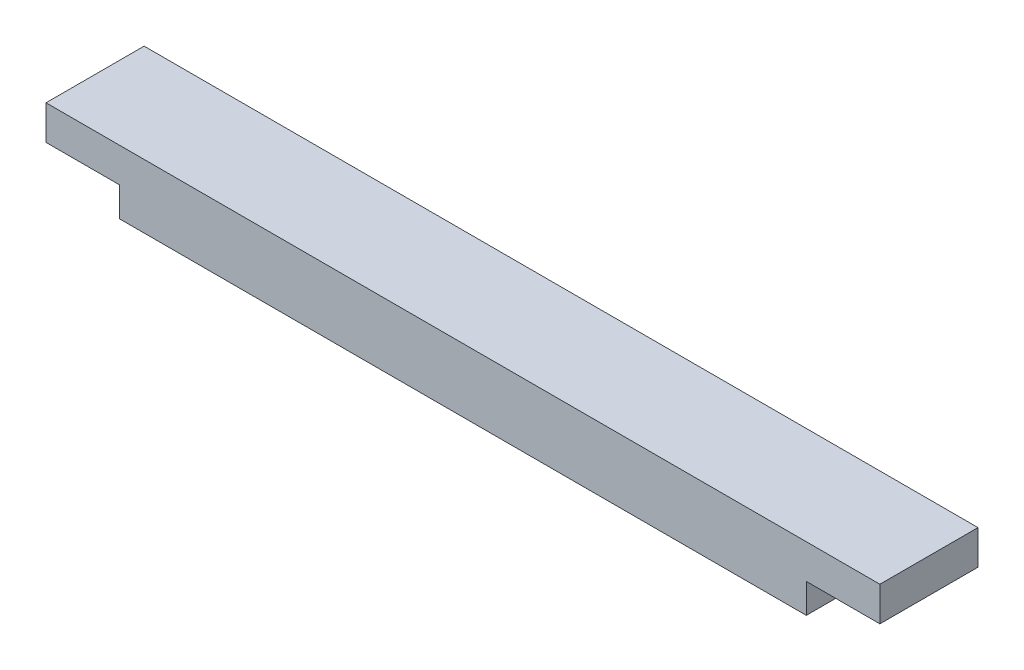
ISO-10303-21;
HEADER;
FILE_DESCRIPTION(('STEP AP214'),'2;1');
FILE_NAME('part.step','',(''),(''),'','','');
FILE_SCHEMA(('AUTOMOTIVE_DESIGN { 1 0 10303 214 1 1 1 1 }'));
ENDSEC;
DATA;
#1=APPLICATION_CONTEXT('core data for automotive mechanical design processes');
#2=APPLICATION_PROTOCOL_DEFINITION('international standard','automotive_design',2000,#1);
#3=PRODUCT_CONTEXT('',#1,'mechanical');
#4=PRODUCT('Part','Part','',(#3));
#5=PRODUCT_RELATED_PRODUCT_CATEGORY('part','',(#4));
#6=PRODUCT_DEFINITION_FORMATION('','',#4);
#7=PRODUCT_DEFINITION_CONTEXT('part definition',#1,'design');
#8=PRODUCT_DEFINITION('design','',#6,#7);
#9=PRODUCT_DEFINITION_SHAPE('','',#8);
#10=(LENGTH_UNIT() NAMED_UNIT(*) SI_UNIT(.MILLI.,.METRE.));
#11=(NAMED_UNIT(*) PLANE_ANGLE_UNIT() SI_UNIT($,.RADIAN.));
#12=(NAMED_UNIT(*) SI_UNIT($,.STERADIAN.) SOLID_ANGLE_UNIT());
#13=UNCERTAINTY_MEASURE_WITH_UNIT(LENGTH_MEASURE(1.E-05),#10,'distance_accuracy_value','');
#14=(GEOMETRIC_REPRESENTATION_CONTEXT(3) GLOBAL_UNCERTAINTY_ASSIGNED_CONTEXT((#13)) GLOBAL_UNIT_ASSIGNED_CONTEXT((#10,
#11,#12)) REPRESENTATION_CONTEXT('',''));
#15=CARTESIAN_POINT('',(0.,0.,0.));
#16=DIRECTION('',(0.,0.,1.));
#17=DIRECTION('',(1.,0.,0.));
#18=AXIS2_PLACEMENT_3D('',#15,#16,#17);
#19=CARTESIAN_POINT('',(70.,6.,10.));
#20=DIRECTION('',(-1.,0.,0.));
#21=DIRECTION('',(0.,0.,1.));
#22=AXIS2_PLACEMENT_3D('',#19,#20,#21);
#23=PLANE('',#22);
#24=DIRECTION('',(0.,0.,-1.));
#25=VECTOR('',#24,1.);
#26=CARTESIAN_POINT('',(70.,0.,10.));
#27=LINE('',#26,#25);
#28=CARTESIAN_POINT('',(70.,0.,10.));
#29=VERTEX_POINT('',#28);
#30=CARTESIAN_POINT('',(70.,0.,-10.));
#31=VERTEX_POINT('',#30);
#32=EDGE_CURVE('E129',#29,#31,#27,.T.);
#33=ORIENTED_EDGE('',*,*,#32,.T.);
#34=DIRECTION('',(0.,-1.,0.));
#35=VECTOR('',#34,1.);
#36=CARTESIAN_POINT('',(70.,6.,-10.));
#37=LINE('',#36,#35);
#38=CARTESIAN_POINT('',(70.,6.,-10.));
#39=VERTEX_POINT('',#38);
#40=EDGE_CURVE('E11',#39,#31,#37,.T.);
#41=ORIENTED_EDGE('',*,*,#40,.F.);
#42=DIRECTION('',(0.,0.,-1.));
#43=VECTOR('',#42,1.);
#44=CARTESIAN_POINT('',(70.,6.,10.));
#45=LINE('',#44,#43);
#46=CARTESIAN_POINT('',(70.,6.,10.));
#47=VERTEX_POINT('',#46);
#48=EDGE_CURVE('E137',#47,#39,#45,.T.);
#49=ORIENTED_EDGE('',*,*,#48,.F.);
#50=DIRECTION('',(0.,-1.,0.));
#51=VECTOR('',#50,1.);
#52=CARTESIAN_POINT('',(70.,6.,10.));
#53=LINE('',#52,#51);
#54=EDGE_CURVE('E49',#47,#29,#53,.T.);
#55=ORIENTED_EDGE('',*,*,#54,.T.);
#56=EDGE_LOOP('',(#33,#41,#49,#55));
#57=FACE_BOUND('',#56,.T.);
#58=ADVANCED_FACE('F33',(#57),#23,.F.);
#59=CARTESIAN_POINT('',(-70.,6.,-10.));
#60=DIRECTION('',(0.,0.,1.));
#61=DIRECTION('',(1.,0.,0.));
#62=AXIS2_PLACEMENT_3D('',#59,#60,#61);
#63=PLANE('',#62);
#64=DIRECTION('',(-1.,0.,0.));
#65=VECTOR('',#64,1.);
#66=CARTESIAN_POINT('',(-70.,0.,-10.));
#67=LINE('',#66,#65);
#68=CARTESIAN_POINT('',(-70.,0.,-10.));
#69=VERTEX_POINT('',#68);
#70=EDGE_CURVE('E131',#31,#69,#67,.T.);
#71=ORIENTED_EDGE('',*,*,#70,.T.);
#72=DIRECTION('',(0.,-1.,0.));
#73=VECTOR('',#72,1.);
#74=CARTESIAN_POINT('',(-70.,6.,-10.));
#75=LINE('',#74,#73);
#76=CARTESIAN_POINT('',(-70.,6.,-10.));
#77=VERTEX_POINT('',#76);
#78=EDGE_CURVE('E41',#77,#69,#75,.T.);
#79=ORIENTED_EDGE('',*,*,#78,.F.);
#80=DIRECTION('',(-1.,0.,0.));
#81=VECTOR('',#80,1.);
#82=CARTESIAN_POINT('',(-85.,6.,-10.));
#83=LINE('',#82,#81);
#84=CARTESIAN_POINT('',(-85.,6.,-10.));
#85=VERTEX_POINT('',#84);
#86=EDGE_CURVE('E173',#77,#85,#83,.T.);
#87=ORIENTED_EDGE('',*,*,#86,.T.);
#88=DIRECTION('',(0.,-1.,0.));
#89=VECTOR('',#88,1.);
#90=CARTESIAN_POINT('',(-85.,13.,-10.));
#91=LINE('',#90,#89);
#92=CARTESIAN_POINT('',(-85.,13.,-10.));
#93=VERTEX_POINT('',#92);
#94=EDGE_CURVE('E111',#93,#85,#91,.T.);
#95=ORIENTED_EDGE('',*,*,#94,.F.);
#96=DIRECTION('',(-1.,0.,0.));
#97=VECTOR('',#96,1.);
#98=CARTESIAN_POINT('',(-85.,13.,-10.));
#99=LINE('',#98,#97);
#100=CARTESIAN_POINT('',(85.,13.,-10.));
#101=VERTEX_POINT('',#100);
#102=EDGE_CURVE('E103',#101,#93,#99,.T.);
#103=ORIENTED_EDGE('',*,*,#102,.F.);
#104=DIRECTION('',(0.,-1.,0.));
#105=VECTOR('',#104,1.);
#106=CARTESIAN_POINT('',(85.,13.,-10.));
#107=LINE('',#106,#105);
#108=CARTESIAN_POINT('',(85.,6.,-10.));
#109=VERTEX_POINT('',#108);
#110=EDGE_CURVE('E108',#101,#109,#107,.T.);
#111=ORIENTED_EDGE('',*,*,#110,.T.);
#112=EDGE_CURVE('E160',#109,#39,#83,.T.);
#113=ORIENTED_EDGE('',*,*,#112,.T.);
#114=ORIENTED_EDGE('',*,*,#40,.T.);
#115=EDGE_LOOP('',(#71,#79,#87,#95,#103,#111,#113,#114));
#116=FACE_BOUND('',#115,.T.);
#117=ADVANCED_FACE('F105',(#116),#63,.F.);
#118=CARTESIAN_POINT('',(-70.,6.,10.));
#119=DIRECTION('',(1.,0.,0.));
#120=DIRECTION('',(0.,0.,-1.));
#121=AXIS2_PLACEMENT_3D('',#118,#119,#120);
#122=PLANE('',#121);
#123=DIRECTION('',(0.,0.,1.));
#124=VECTOR('',#123,1.);
#125=CARTESIAN_POINT('',(-70.,0.,10.));
#126=LINE('',#125,#124);
#127=CARTESIAN_POINT('',(-70.,0.,10.));
#128=VERTEX_POINT('',#127);
#129=EDGE_CURVE('E68',#69,#128,#126,.T.);
#130=ORIENTED_EDGE('',*,*,#129,.T.);
#131=DIRECTION('',(0.,-1.,0.));
#132=VECTOR('',#131,1.);
#133=CARTESIAN_POINT('',(-70.,6.,10.));
#134=LINE('',#133,#132);
#135=CARTESIAN_POINT('',(-70.,6.,10.));
#136=VERTEX_POINT('',#135);
#137=EDGE_CURVE('E146',#136,#128,#134,.T.);
#138=ORIENTED_EDGE('',*,*,#137,.F.);
#139=DIRECTION('',(0.,0.,1.));
#140=VECTOR('',#139,1.);
#141=CARTESIAN_POINT('',(-70.,6.,10.));
#142=LINE('',#141,#140);
#143=EDGE_CURVE('E139',#77,#136,#142,.T.);
#144=ORIENTED_EDGE('',*,*,#143,.F.);
#145=ORIENTED_EDGE('',*,*,#78,.T.);
#146=EDGE_LOOP('',(#130,#138,#144,#145));
#147=FACE_BOUND('',#146,.T.);
#148=ADVANCED_FACE('F148',(#147),#122,.F.);
#149=CARTESIAN_POINT('',(-70.,6.,10.));
#150=DIRECTION('',(0.,0.,-1.));
#151=DIRECTION('',(-1.,0.,0.));
#152=AXIS2_PLACEMENT_3D('',#149,#150,#151);
#153=PLANE('',#152);
#154=DIRECTION('',(1.,0.,0.));
#155=VECTOR('',#154,1.);
#156=CARTESIAN_POINT('',(-70.,0.,10.));
#157=LINE('',#156,#155);
#158=EDGE_CURVE('E71',#128,#29,#157,.T.);
#159=ORIENTED_EDGE('',*,*,#158,.T.);
#160=ORIENTED_EDGE('',*,*,#54,.F.);
#161=DIRECTION('',(1.,0.,0.));
#162=VECTOR('',#161,1.);
#163=CARTESIAN_POINT('',(-85.,6.,10.));
#164=LINE('',#163,#162);
#165=CARTESIAN_POINT('',(85.,6.,10.));
#166=VERTEX_POINT('',#165);
#167=EDGE_CURVE('E155',#47,#166,#164,.T.);
#168=ORIENTED_EDGE('',*,*,#167,.T.);
#169=DIRECTION('',(0.,-1.,0.));
#170=VECTOR('',#169,1.);
#171=CARTESIAN_POINT('',(85.,13.,10.));
#172=LINE('',#171,#170);
#173=CARTESIAN_POINT('',(85.,13.,10.));
#174=VERTEX_POINT('',#173);
#175=EDGE_CURVE('E164',#174,#166,#172,.T.);
#176=ORIENTED_EDGE('',*,*,#175,.F.);
#177=DIRECTION('',(1.,0.,0.));
#178=VECTOR('',#177,1.);
#179=CARTESIAN_POINT('',(-85.,13.,10.));
#180=LINE('',#179,#178);
#181=CARTESIAN_POINT('',(-85.,13.,10.));
#182=VERTEX_POINT('',#181);
#183=EDGE_CURVE('E120',#182,#174,#180,.T.);
#184=ORIENTED_EDGE('',*,*,#183,.F.);
#185=DIRECTION('',(0.,-1.,0.));
#186=VECTOR('',#185,1.);
#187=CARTESIAN_POINT('',(-85.,13.,10.));
#188=LINE('',#187,#186);
#189=CARTESIAN_POINT('',(-85.,6.,10.));
#190=VERTEX_POINT('',#189);
#191=EDGE_CURVE('E133',#182,#190,#188,.T.);
#192=ORIENTED_EDGE('',*,*,#191,.T.);
#193=EDGE_CURVE('E124',#190,#136,#164,.T.);
#194=ORIENTED_EDGE('',*,*,#193,.T.);
#195=ORIENTED_EDGE('',*,*,#137,.T.);
#196=EDGE_LOOP('',(#159,#160,#168,#176,#184,#192,#194,#195));
#197=FACE_BOUND('',#196,.T.);
#198=ADVANCED_FACE('F168',(#197),#153,.F.);
#199=CARTESIAN_POINT('',(0.,0.,0.));
#200=DIRECTION('',(0.,-1.,0.));
#201=DIRECTION('',(0.,0.,-1.));
#202=AXIS2_PLACEMENT_3D('',#199,#200,#201);
#203=PLANE('',#202);
#204=ORIENTED_EDGE('',*,*,#32,.F.);
#205=ORIENTED_EDGE('',*,*,#158,.F.);
#206=ORIENTED_EDGE('',*,*,#129,.F.);
#207=ORIENTED_EDGE('',*,*,#70,.F.);
#208=EDGE_LOOP('',(#204,#205,#206,#207));
#209=FACE_BOUND('',#208,.T.);
#210=ADVANCED_FACE('F152',(#209),#203,.T.);
#211=CARTESIAN_POINT('',(0.,6.,0.));
#212=DIRECTION('',(0.,-1.,0.));
#213=DIRECTION('',(0.,0.,-1.));
#214=AXIS2_PLACEMENT_3D('',#211,#212,#213);
#215=PLANE('',#214);
#216=ORIENTED_EDGE('',*,*,#167,.F.);
#217=ORIENTED_EDGE('',*,*,#48,.T.);
#218=ORIENTED_EDGE('',*,*,#112,.F.);
#219=DIRECTION('',(0.,0.,-1.));
#220=VECTOR('',#219,1.);
#221=CARTESIAN_POINT('',(85.,6.,10.));
#222=LINE('',#221,#220);
#223=EDGE_CURVE('E128',#166,#109,#222,.T.);
#224=ORIENTED_EDGE('',*,*,#223,.F.);
#225=EDGE_LOOP('',(#216,#217,#218,#224));
#226=FACE_BOUND('',#225,.T.);
#227=ADVANCED_FACE('F156',(#226),#215,.T.);
#228=CARTESIAN_POINT('',(85.,13.,10.));
#229=DIRECTION('',(-1.,0.,0.));
#230=DIRECTION('',(0.,0.,1.));
#231=AXIS2_PLACEMENT_3D('',#228,#229,#230);
#232=PLANE('',#231);
#233=ORIENTED_EDGE('',*,*,#223,.T.);
#234=ORIENTED_EDGE('',*,*,#110,.F.);
#235=DIRECTION('',(0.,0.,-1.));
#236=VECTOR('',#235,1.);
#237=CARTESIAN_POINT('',(85.,13.,10.));
#238=LINE('',#237,#236);
#239=EDGE_CURVE('E115',#174,#101,#238,.T.);
#240=ORIENTED_EDGE('',*,*,#239,.F.);
#241=ORIENTED_EDGE('',*,*,#175,.T.);
#242=EDGE_LOOP('',(#233,#234,#240,#241));
#243=FACE_BOUND('',#242,.T.);
#244=ADVANCED_FACE('F126',(#243),#232,.F.);
#245=CARTESIAN_POINT('',(-85.,13.,10.));
#246=DIRECTION('',(1.,0.,0.));
#247=DIRECTION('',(0.,0.,-1.));
#248=AXIS2_PLACEMENT_3D('',#245,#246,#247);
#249=PLANE('',#248);
#250=DIRECTION('',(0.,0.,1.));
#251=VECTOR('',#250,1.);
#252=CARTESIAN_POINT('',(-85.,6.,10.));
#253=LINE('',#252,#251);
#254=EDGE_CURVE('E157',#85,#190,#253,.T.);
#255=ORIENTED_EDGE('',*,*,#254,.T.);
#256=ORIENTED_EDGE('',*,*,#191,.F.);
#257=DIRECTION('',(0.,0.,1.));
#258=VECTOR('',#257,1.);
#259=CARTESIAN_POINT('',(-85.,13.,10.));
#260=LINE('',#259,#258);
#261=EDGE_CURVE('E114',#93,#182,#260,.T.);
#262=ORIENTED_EDGE('',*,*,#261,.F.);
#263=ORIENTED_EDGE('',*,*,#94,.T.);
#264=EDGE_LOOP('',(#255,#256,#262,#263));
#265=FACE_BOUND('',#264,.T.);
#266=ADVANCED_FACE('F177',(#265),#249,.F.);
#267=CARTESIAN_POINT('',(0.,13.,0.));
#268=DIRECTION('',(0.,-1.,0.));
#269=DIRECTION('',(0.,0.,-1.));
#270=AXIS2_PLACEMENT_3D('',#267,#268,#269);
#271=PLANE('',#270);
#272=ORIENTED_EDGE('',*,*,#239,.T.);
#273=ORIENTED_EDGE('',*,*,#102,.T.);
#274=ORIENTED_EDGE('',*,*,#261,.T.);
#275=ORIENTED_EDGE('',*,*,#183,.T.);
#276=EDGE_LOOP('',(#272,#273,#274,#275));
#277=FACE_BOUND('',#276,.T.);
#278=ADVANCED_FACE('F118',(#277),#271,.F.);
#279=ORIENTED_EDGE('',*,*,#86,.F.);
#280=ORIENTED_EDGE('',*,*,#143,.T.);
#281=ORIENTED_EDGE('',*,*,#193,.F.);
#282=ORIENTED_EDGE('',*,*,#254,.F.);
#283=EDGE_LOOP('',(#279,#280,#281,#282));
#284=FACE_BOUND('',#283,.T.);
#285=ADVANCED_FACE('F172',(#284),#215,.T.);
#286=CLOSED_SHELL('',(#58,#117,#148,#198,#210,#227,#244,#266,#278,#285));
#287=MANIFOLD_SOLID_BREP('B2',#286);
#288=ADVANCED_BREP_SHAPE_REPRESENTATION('',(#18,#287),#14);
#289=SHAPE_DEFINITION_REPRESENTATION(#9,#288);
ENDSEC;
END-ISO-10303-21;
